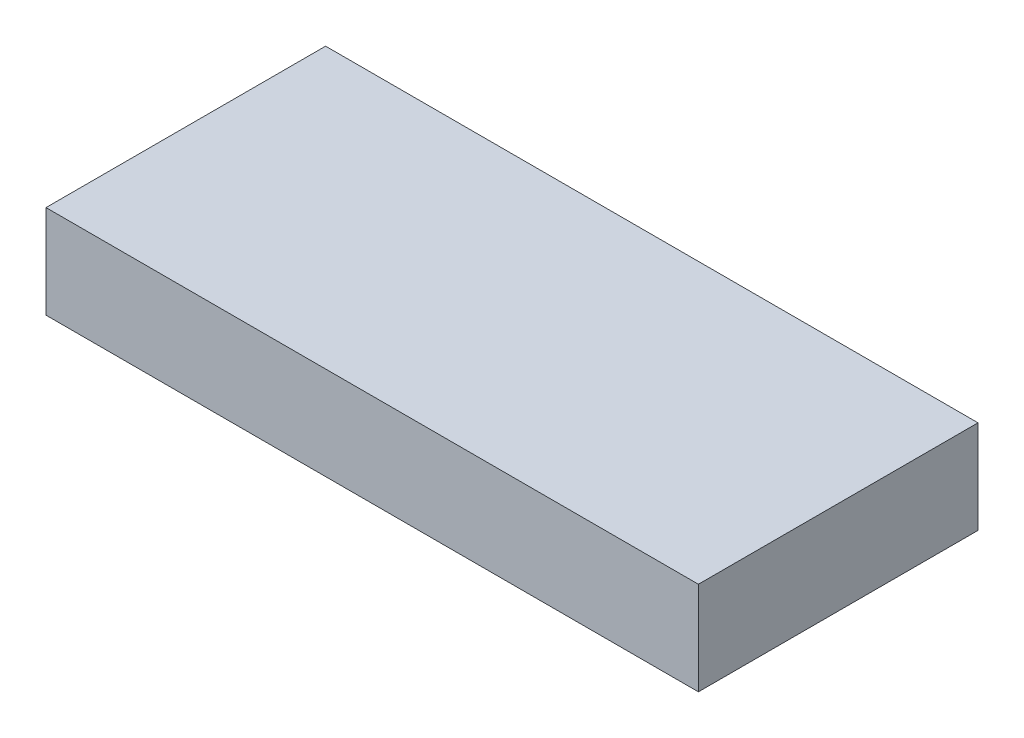
ISO-10303-21;
HEADER;
FILE_DESCRIPTION(('STEP AP214'),'2;1');
FILE_NAME('part.step','',(''),(''),'','','');
FILE_SCHEMA(('AUTOMOTIVE_DESIGN { 1 0 10303 214 1 1 1 1 }'));
ENDSEC;
DATA;
#1=APPLICATION_CONTEXT('core data for automotive mechanical design processes');
#2=APPLICATION_PROTOCOL_DEFINITION('international standard','automotive_design',2000,#1);
#3=PRODUCT_CONTEXT('',#1,'mechanical');
#4=PRODUCT('Part','Part','',(#3));
#5=PRODUCT_RELATED_PRODUCT_CATEGORY('part','',(#4));
#6=PRODUCT_DEFINITION_FORMATION('','',#4);
#7=PRODUCT_DEFINITION_CONTEXT('part definition',#1,'design');
#8=PRODUCT_DEFINITION('design','',#6,#7);
#9=PRODUCT_DEFINITION_SHAPE('','',#8);
#10=(LENGTH_UNIT() NAMED_UNIT(*) SI_UNIT(.MILLI.,.METRE.));
#11=(NAMED_UNIT(*) PLANE_ANGLE_UNIT() SI_UNIT($,.RADIAN.));
#12=(NAMED_UNIT(*) SI_UNIT($,.STERADIAN.) SOLID_ANGLE_UNIT());
#13=UNCERTAINTY_MEASURE_WITH_UNIT(LENGTH_MEASURE(1.E-05),#10,'distance_accuracy_value','');
#14=(GEOMETRIC_REPRESENTATION_CONTEXT(3) GLOBAL_UNCERTAINTY_ASSIGNED_CONTEXT((#13)) GLOBAL_UNIT_ASSIGNED_CONTEXT((#10,
#11,#12)) REPRESENTATION_CONTEXT('',''));
#15=CARTESIAN_POINT('',(0.,0.,0.));
#16=DIRECTION('',(0.,0.,1.));
#17=DIRECTION('',(1.,0.,0.));
#18=AXIS2_PLACEMENT_3D('',#15,#16,#17);
#19=CARTESIAN_POINT('',(22.225,6.35,9.525));
#20=DIRECTION('',(-1.,0.,0.));
#21=DIRECTION('',(0.,0.,1.));
#22=AXIS2_PLACEMENT_3D('',#19,#20,#21);
#23=PLANE('',#22);
#24=DIRECTION('',(0.,0.,-1.));
#25=VECTOR('',#24,1.);
#26=CARTESIAN_POINT('',(22.225,0.,9.525));
#27=LINE('',#26,#25);
#28=CARTESIAN_POINT('',(22.225,0.,9.525));
#29=VERTEX_POINT('',#28);
#30=CARTESIAN_POINT('',(22.225,0.,-9.525));
#31=VERTEX_POINT('',#30);
#32=EDGE_CURVE('E97',#29,#31,#27,.T.);
#33=ORIENTED_EDGE('',*,*,#32,.T.);
#34=DIRECTION('',(0.,-1.,0.));
#35=VECTOR('',#34,1.);
#36=CARTESIAN_POINT('',(22.225,6.35,-9.525));
#37=LINE('',#36,#35);
#38=CARTESIAN_POINT('',(22.225,6.35,-9.525));
#39=VERTEX_POINT('',#38);
#40=EDGE_CURVE('E11',#39,#31,#37,.T.);
#41=ORIENTED_EDGE('',*,*,#40,.F.);
#42=DIRECTION('',(0.,0.,-1.));
#43=VECTOR('',#42,1.);
#44=CARTESIAN_POINT('',(22.225,6.35,9.525));
#45=LINE('',#44,#43);
#46=CARTESIAN_POINT('',(22.225,6.35,9.525));
#47=VERTEX_POINT('',#46);
#48=EDGE_CURVE('E85',#47,#39,#45,.T.);
#49=ORIENTED_EDGE('',*,*,#48,.F.);
#50=DIRECTION('',(0.,-1.,0.));
#51=VECTOR('',#50,1.);
#52=CARTESIAN_POINT('',(22.225,6.35,9.525));
#53=LINE('',#52,#51);
#54=EDGE_CURVE('E93',#47,#29,#53,.T.);
#55=ORIENTED_EDGE('',*,*,#54,.T.);
#56=EDGE_LOOP('',(#33,#41,#49,#55));
#57=FACE_BOUND('',#56,.T.);
#58=ADVANCED_FACE('F34',(#57),#23,.F.);
#59=CARTESIAN_POINT('',(-22.225,6.35,-9.525));
#60=DIRECTION('',(0.,0.,1.));
#61=DIRECTION('',(1.,0.,0.));
#62=AXIS2_PLACEMENT_3D('',#59,#60,#61);
#63=PLANE('',#62);
#64=DIRECTION('',(-1.,0.,0.));
#65=VECTOR('',#64,1.);
#66=CARTESIAN_POINT('',(-22.225,0.,-9.525));
#67=LINE('',#66,#65);
#68=CARTESIAN_POINT('',(-22.225,0.,-9.525));
#69=VERTEX_POINT('',#68);
#70=EDGE_CURVE('E89',#31,#69,#67,.T.);
#71=ORIENTED_EDGE('',*,*,#70,.T.);
#72=DIRECTION('',(0.,-1.,0.));
#73=VECTOR('',#72,1.);
#74=CARTESIAN_POINT('',(-22.225,6.35,-9.525));
#75=LINE('',#74,#73);
#76=CARTESIAN_POINT('',(-22.225,6.35,-9.525));
#77=VERTEX_POINT('',#76);
#78=EDGE_CURVE('E42',#77,#69,#75,.T.);
#79=ORIENTED_EDGE('',*,*,#78,.F.);
#80=DIRECTION('',(-1.,0.,0.));
#81=VECTOR('',#80,1.);
#82=CARTESIAN_POINT('',(-22.225,6.35,-9.525));
#83=LINE('',#82,#81);
#84=EDGE_CURVE('E80',#39,#77,#83,.T.);
#85=ORIENTED_EDGE('',*,*,#84,.F.);
#86=ORIENTED_EDGE('',*,*,#40,.T.);
#87=EDGE_LOOP('',(#71,#79,#85,#86));
#88=FACE_BOUND('',#87,.T.);
#89=ADVANCED_FACE('F88',(#88),#63,.F.);
#90=CARTESIAN_POINT('',(-22.225,6.35,9.525));
#91=DIRECTION('',(1.,0.,0.));
#92=DIRECTION('',(0.,0.,-1.));
#93=AXIS2_PLACEMENT_3D('',#90,#91,#92);
#94=PLANE('',#93);
#95=DIRECTION('',(0.,0.,1.));
#96=VECTOR('',#95,1.);
#97=CARTESIAN_POINT('',(-22.225,0.,9.525));
#98=LINE('',#97,#96);
#99=CARTESIAN_POINT('',(-22.225,0.,9.525));
#100=VERTEX_POINT('',#99);
#101=EDGE_CURVE('E67',#69,#100,#98,.T.);
#102=ORIENTED_EDGE('',*,*,#101,.T.);
#103=DIRECTION('',(0.,-1.,0.));
#104=VECTOR('',#103,1.);
#105=CARTESIAN_POINT('',(-22.225,6.35,9.525));
#106=LINE('',#105,#104);
#107=CARTESIAN_POINT('',(-22.225,6.35,9.525));
#108=VERTEX_POINT('',#107);
#109=EDGE_CURVE('E90',#108,#100,#106,.T.);
#110=ORIENTED_EDGE('',*,*,#109,.F.);
#111=DIRECTION('',(0.,0.,1.));
#112=VECTOR('',#111,1.);
#113=CARTESIAN_POINT('',(-22.225,6.35,9.525));
#114=LINE('',#113,#112);
#115=EDGE_CURVE('E83',#77,#108,#114,.T.);
#116=ORIENTED_EDGE('',*,*,#115,.F.);
#117=ORIENTED_EDGE('',*,*,#78,.T.);
#118=EDGE_LOOP('',(#102,#110,#116,#117));
#119=FACE_BOUND('',#118,.T.);
#120=ADVANCED_FACE('F91',(#119),#94,.F.);
#121=CARTESIAN_POINT('',(-22.225,6.35,9.525));
#122=DIRECTION('',(0.,0.,-1.));
#123=DIRECTION('',(-1.,0.,0.));
#124=AXIS2_PLACEMENT_3D('',#121,#122,#123);
#125=PLANE('',#124);
#126=DIRECTION('',(1.,0.,0.));
#127=VECTOR('',#126,1.);
#128=CARTESIAN_POINT('',(-22.225,0.,9.525));
#129=LINE('',#128,#127);
#130=EDGE_CURVE('E73',#100,#29,#129,.T.);
#131=ORIENTED_EDGE('',*,*,#130,.T.);
#132=ORIENTED_EDGE('',*,*,#54,.F.);
#133=DIRECTION('',(1.,0.,0.));
#134=VECTOR('',#133,1.);
#135=CARTESIAN_POINT('',(-22.225,6.35,9.525));
#136=LINE('',#135,#134);
#137=EDGE_CURVE('E50',#108,#47,#136,.T.);
#138=ORIENTED_EDGE('',*,*,#137,.F.);
#139=ORIENTED_EDGE('',*,*,#109,.T.);
#140=EDGE_LOOP('',(#131,#132,#138,#139));
#141=FACE_BOUND('',#140,.T.);
#142=ADVANCED_FACE('F104',(#141),#125,.F.);
#143=CARTESIAN_POINT('',(0.,6.35,0.));
#144=DIRECTION('',(0.,-1.,0.));
#145=DIRECTION('',(0.,0.,-1.));
#146=AXIS2_PLACEMENT_3D('',#143,#144,#145);
#147=PLANE('',#146);
#148=ORIENTED_EDGE('',*,*,#48,.T.);
#149=ORIENTED_EDGE('',*,*,#84,.T.);
#150=ORIENTED_EDGE('',*,*,#115,.T.);
#151=ORIENTED_EDGE('',*,*,#137,.T.);
#152=EDGE_LOOP('',(#148,#149,#150,#151));
#153=FACE_BOUND('',#152,.T.);
#154=ADVANCED_FACE('F81',(#153),#147,.F.);
#155=CARTESIAN_POINT('',(0.,0.,0.));
#156=DIRECTION('',(0.,-1.,0.));
#157=DIRECTION('',(0.,0.,-1.));
#158=AXIS2_PLACEMENT_3D('',#155,#156,#157);
#159=PLANE('',#158);
#160=ORIENTED_EDGE('',*,*,#32,.F.);
#161=ORIENTED_EDGE('',*,*,#130,.F.);
#162=ORIENTED_EDGE('',*,*,#101,.F.);
#163=ORIENTED_EDGE('',*,*,#70,.F.);
#164=EDGE_LOOP('',(#160,#161,#162,#163));
#165=FACE_BOUND('',#164,.T.);
#166=ADVANCED_FACE('F107',(#165),#159,.T.);
#167=CLOSED_SHELL('',(#58,#89,#120,#142,#154,#166));
#168=MANIFOLD_SOLID_BREP('B2',#167);
#169=ADVANCED_BREP_SHAPE_REPRESENTATION('',(#18,#168),#14);
#170=SHAPE_DEFINITION_REPRESENTATION(#9,#169);
ENDSEC;
END-ISO-10303-21;
